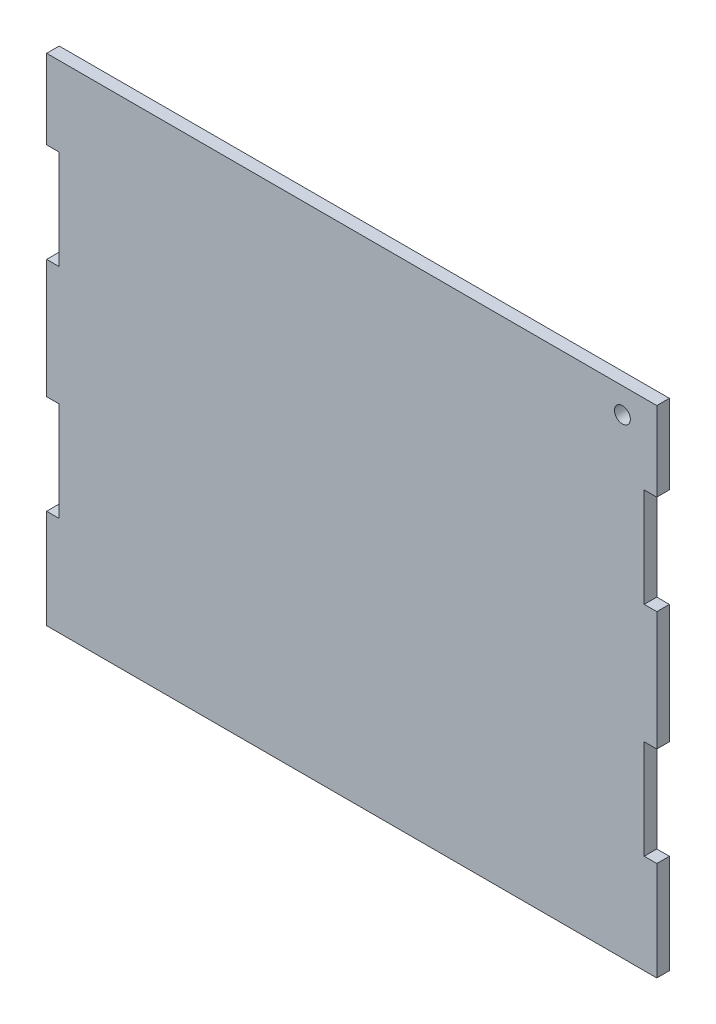
ISO-10303-21;
HEADER;
FILE_DESCRIPTION(('STEP AP214'),'2;1');
FILE_NAME('part.step','',(''),(''),'','','');
FILE_SCHEMA(('AUTOMOTIVE_DESIGN { 1 0 10303 214 1 1 1 1 }'));
ENDSEC;
DATA;
#1=APPLICATION_CONTEXT('core data for automotive mechanical design processes');
#2=APPLICATION_PROTOCOL_DEFINITION('international standard','automotive_design',2000,#1);
#3=PRODUCT_CONTEXT('',#1,'mechanical');
#4=PRODUCT('Part','Part','',(#3));
#5=PRODUCT_RELATED_PRODUCT_CATEGORY('part','',(#4));
#6=PRODUCT_DEFINITION_FORMATION('','',#4);
#7=PRODUCT_DEFINITION_CONTEXT('part definition',#1,'design');
#8=PRODUCT_DEFINITION('design','',#6,#7);
#9=PRODUCT_DEFINITION_SHAPE('','',#8);
#10=(LENGTH_UNIT() NAMED_UNIT(*) SI_UNIT(.MILLI.,.METRE.));
#11=(NAMED_UNIT(*) PLANE_ANGLE_UNIT() SI_UNIT($,.RADIAN.));
#12=(NAMED_UNIT(*) SI_UNIT($,.STERADIAN.) SOLID_ANGLE_UNIT());
#13=UNCERTAINTY_MEASURE_WITH_UNIT(LENGTH_MEASURE(1.E-05),#10,'distance_accuracy_value','');
#14=(GEOMETRIC_REPRESENTATION_CONTEXT(3) GLOBAL_UNCERTAINTY_ASSIGNED_CONTEXT((#13)) GLOBAL_UNIT_ASSIGNED_CONTEXT((#10,
#11,#12)) REPRESENTATION_CONTEXT('',''));
#15=CARTESIAN_POINT('',(0.,0.,0.));
#16=DIRECTION('',(0.,0.,1.));
#17=DIRECTION('',(1.,0.,0.));
#18=AXIS2_PLACEMENT_3D('',#15,#16,#17);
#19=CARTESIAN_POINT('',(0.,0.,6.35));
#20=DIRECTION('',(1.,0.,0.));
#21=DIRECTION('',(0.,1.,0.));
#22=AXIS2_PLACEMENT_3D('',#19,#20,#21);
#23=PLANE('',#22);
#24=DIRECTION('',(0.,-1.,0.));
#25=VECTOR('',#24,1.);
#26=CARTESIAN_POINT('',(0.,0.,0.));
#27=LINE('',#26,#25);
#28=CARTESIAN_POINT('',(0.,160.,0.));
#29=VERTEX_POINT('',#28);
#30=CARTESIAN_POINT('',(0.,100.,0.));
#31=VERTEX_POINT('',#30);
#32=EDGE_CURVE('E205',#29,#31,#27,.T.);
#33=ORIENTED_EDGE('',*,*,#32,.T.);
#34=DIRECTION('',(0.,0.,1.));
#35=VECTOR('',#34,1.);
#36=CARTESIAN_POINT('',(0.,100.,0.));
#37=LINE('',#36,#35);
#38=CARTESIAN_POINT('',(0.,100.,6.35));
#39=VERTEX_POINT('',#38);
#40=EDGE_CURVE('E252',#31,#39,#37,.T.);
#41=ORIENTED_EDGE('',*,*,#40,.T.);
#42=DIRECTION('',(0.,-1.,0.));
#43=VECTOR('',#42,1.);
#44=CARTESIAN_POINT('',(0.,0.,6.35));
#45=LINE('',#44,#43);
#46=CARTESIAN_POINT('',(0.,160.,6.35));
#47=VERTEX_POINT('',#46);
#48=EDGE_CURVE('E344',#47,#39,#45,.T.);
#49=ORIENTED_EDGE('',*,*,#48,.F.);
#50=DIRECTION('',(0.,0.,1.));
#51=VECTOR('',#50,1.);
#52=CARTESIAN_POINT('',(0.,160.,0.));
#53=LINE('',#52,#51);
#54=EDGE_CURVE('E220',#29,#47,#53,.T.);
#55=ORIENTED_EDGE('',*,*,#54,.F.);
#56=EDGE_LOOP('',(#33,#41,#49,#55));
#57=FACE_BOUND('',#56,.T.);
#58=ADVANCED_FACE('F39',(#57),#23,.F.);
#59=CARTESIAN_POINT('',(0.,50.,6.35));
#60=VERTEX_POINT('',#59);
#61=CARTESIAN_POINT('',(0.,0.,6.35));
#62=VERTEX_POINT('',#61);
#63=EDGE_CURVE('E345',#60,#62,#45,.T.);
#64=ORIENTED_EDGE('',*,*,#63,.F.);
#65=DIRECTION('',(0.,0.,1.));
#66=VECTOR('',#65,1.);
#67=CARTESIAN_POINT('',(0.,50.,0.));
#68=LINE('',#67,#66);
#69=CARTESIAN_POINT('',(0.,50.,0.));
#70=VERTEX_POINT('',#69);
#71=EDGE_CURVE('E282',#70,#60,#68,.T.);
#72=ORIENTED_EDGE('',*,*,#71,.F.);
#73=CARTESIAN_POINT('',(0.,0.,0.));
#74=VERTEX_POINT('',#73);
#75=EDGE_CURVE('E330',#70,#74,#27,.T.);
#76=ORIENTED_EDGE('',*,*,#75,.T.);
#77=DIRECTION('',(0.,0.,-1.));
#78=VECTOR('',#77,1.);
#79=CARTESIAN_POINT('',(0.,0.,6.35));
#80=LINE('',#79,#78);
#81=EDGE_CURVE('E11',#62,#74,#80,.T.);
#82=ORIENTED_EDGE('',*,*,#81,.F.);
#83=EDGE_LOOP('',(#64,#72,#76,#82));
#84=FACE_BOUND('',#83,.T.);
#85=ADVANCED_FACE('F404',(#84),#23,.F.);
#86=CARTESIAN_POINT('',(307.7,0.,6.35));
#87=DIRECTION('',(-1.,0.,0.));
#88=DIRECTION('',(0.,-1.,0.));
#89=AXIS2_PLACEMENT_3D('',#86,#87,#88);
#90=PLANE('',#89);
#91=DIRECTION('',(0.,1.,0.));
#92=VECTOR('',#91,1.);
#93=CARTESIAN_POINT('',(307.7,0.,0.));
#94=LINE('',#93,#92);
#95=CARTESIAN_POINT('',(307.7,100.,0.));
#96=VERTEX_POINT('',#95);
#97=CARTESIAN_POINT('',(307.7,160.,0.));
#98=VERTEX_POINT('',#97);
#99=EDGE_CURVE('E371',#96,#98,#94,.T.);
#100=ORIENTED_EDGE('',*,*,#99,.T.);
#101=DIRECTION('',(0.,0.,1.));
#102=VECTOR('',#101,1.);
#103=CARTESIAN_POINT('',(307.7,160.,0.));
#104=LINE('',#103,#102);
#105=CARTESIAN_POINT('',(307.7,160.,6.35));
#106=VERTEX_POINT('',#105);
#107=EDGE_CURVE('E247',#98,#106,#104,.T.);
#108=ORIENTED_EDGE('',*,*,#107,.T.);
#109=DIRECTION('',(0.,1.,0.));
#110=VECTOR('',#109,1.);
#111=CARTESIAN_POINT('',(307.7,0.,6.35));
#112=LINE('',#111,#110);
#113=CARTESIAN_POINT('',(307.7,100.,6.35));
#114=VERTEX_POINT('',#113);
#115=EDGE_CURVE('E354',#114,#106,#112,.T.);
#116=ORIENTED_EDGE('',*,*,#115,.F.);
#117=DIRECTION('',(0.,0.,1.));
#118=VECTOR('',#117,1.);
#119=CARTESIAN_POINT('',(307.7,100.,0.));
#120=LINE('',#119,#118);
#121=EDGE_CURVE('E316',#96,#114,#120,.T.);
#122=ORIENTED_EDGE('',*,*,#121,.F.);
#123=EDGE_LOOP('',(#100,#108,#116,#122));
#124=FACE_BOUND('',#123,.T.);
#125=ADVANCED_FACE('F435',(#124),#90,.F.);
#126=CARTESIAN_POINT('',(307.7,0.,0.));
#127=VERTEX_POINT('',#126);
#128=CARTESIAN_POINT('',(307.7,50.,0.));
#129=VERTEX_POINT('',#128);
#130=EDGE_CURVE('E366',#127,#129,#94,.T.);
#131=ORIENTED_EDGE('',*,*,#130,.T.);
#132=DIRECTION('',(0.,0.,1.));
#133=VECTOR('',#132,1.);
#134=CARTESIAN_POINT('',(307.7,50.,0.));
#135=LINE('',#134,#133);
#136=CARTESIAN_POINT('',(307.7,50.,6.35));
#137=VERTEX_POINT('',#136);
#138=EDGE_CURVE('E326',#129,#137,#135,.T.);
#139=ORIENTED_EDGE('',*,*,#138,.T.);
#140=CARTESIAN_POINT('',(307.7,0.,6.35));
#141=VERTEX_POINT('',#140);
#142=EDGE_CURVE('E349',#141,#137,#112,.T.);
#143=ORIENTED_EDGE('',*,*,#142,.F.);
#144=DIRECTION('',(0.,0.,-1.));
#145=VECTOR('',#144,1.);
#146=CARTESIAN_POINT('',(307.7,0.,6.35));
#147=LINE('',#146,#145);
#148=EDGE_CURVE('E48',#141,#127,#147,.T.);
#149=ORIENTED_EDGE('',*,*,#148,.T.);
#150=EDGE_LOOP('',(#131,#139,#143,#149));
#151=FACE_BOUND('',#150,.T.);
#152=ADVANCED_FACE('F386',(#151),#90,.F.);
#153=CARTESIAN_POINT('',(0.,250.,0.));
#154=VERTEX_POINT('',#153);
#155=CARTESIAN_POINT('',(0.,210.,0.));
#156=VERTEX_POINT('',#155);
#157=EDGE_CURVE('E358',#154,#156,#27,.T.);
#158=ORIENTED_EDGE('',*,*,#157,.T.);
#159=DIRECTION('',(0.,0.,1.));
#160=VECTOR('',#159,1.);
#161=CARTESIAN_POINT('',(0.,210.,0.));
#162=LINE('',#161,#160);
#163=CARTESIAN_POINT('',(0.,210.,6.35));
#164=VERTEX_POINT('',#163);
#165=EDGE_CURVE('E224',#156,#164,#162,.T.);
#166=ORIENTED_EDGE('',*,*,#165,.T.);
#167=CARTESIAN_POINT('',(0.,250.,6.35));
#168=VERTEX_POINT('',#167);
#169=EDGE_CURVE('E339',#168,#164,#45,.T.);
#170=ORIENTED_EDGE('',*,*,#169,.F.);
#171=DIRECTION('',(0.,0.,-1.));
#172=VECTOR('',#171,1.);
#173=CARTESIAN_POINT('',(0.,250.,6.35));
#174=LINE('',#173,#172);
#175=EDGE_CURVE('E357',#168,#154,#174,.T.);
#176=ORIENTED_EDGE('',*,*,#175,.T.);
#177=EDGE_LOOP('',(#158,#166,#170,#176));
#178=FACE_BOUND('',#177,.T.);
#179=ADVANCED_FACE('F41',(#178),#23,.F.);
#180=CARTESIAN_POINT('',(0.,0.,6.35));
#181=DIRECTION('',(0.,1.,0.));
#182=DIRECTION('',(0.,0.,1.));
#183=AXIS2_PLACEMENT_3D('',#180,#181,#182);
#184=PLANE('',#183);
#185=DIRECTION('',(1.,0.,0.));
#186=VECTOR('',#185,1.);
#187=CARTESIAN_POINT('',(0.,0.,0.));
#188=LINE('',#187,#186);
#189=EDGE_CURVE('E362',#74,#127,#188,.T.);
#190=ORIENTED_EDGE('',*,*,#189,.T.);
#191=ORIENTED_EDGE('',*,*,#148,.F.);
#192=DIRECTION('',(1.,0.,0.));
#193=VECTOR('',#192,1.);
#194=CARTESIAN_POINT('',(0.,0.,6.35));
#195=LINE('',#194,#193);
#196=EDGE_CURVE('E343',#62,#141,#195,.T.);
#197=ORIENTED_EDGE('',*,*,#196,.F.);
#198=ORIENTED_EDGE('',*,*,#81,.T.);
#199=EDGE_LOOP('',(#190,#191,#197,#198));
#200=FACE_BOUND('',#199,.T.);
#201=ADVANCED_FACE('F402',(#200),#184,.F.);
#202=CARTESIAN_POINT('',(307.7,210.,6.35));
#203=VERTEX_POINT('',#202);
#204=CARTESIAN_POINT('',(307.7,250.,6.35));
#205=VERTEX_POINT('',#204);
#206=EDGE_CURVE('E348',#203,#205,#112,.T.);
#207=ORIENTED_EDGE('',*,*,#206,.F.);
#208=DIRECTION('',(0.,0.,1.));
#209=VECTOR('',#208,1.);
#210=CARTESIAN_POINT('',(307.7,210.,0.));
#211=LINE('',#210,#209);
#212=CARTESIAN_POINT('',(307.7,210.,0.));
#213=VERTEX_POINT('',#212);
#214=EDGE_CURVE('E266',#213,#203,#211,.T.);
#215=ORIENTED_EDGE('',*,*,#214,.F.);
#216=CARTESIAN_POINT('',(307.7,250.,0.));
#217=VERTEX_POINT('',#216);
#218=EDGE_CURVE('E365',#213,#217,#94,.T.);
#219=ORIENTED_EDGE('',*,*,#218,.T.);
#220=DIRECTION('',(0.,0.,-1.));
#221=VECTOR('',#220,1.);
#222=CARTESIAN_POINT('',(307.7,250.,6.35));
#223=LINE('',#222,#221);
#224=EDGE_CURVE('E377',#205,#217,#223,.T.);
#225=ORIENTED_EDGE('',*,*,#224,.F.);
#226=EDGE_LOOP('',(#207,#215,#219,#225));
#227=FACE_BOUND('',#226,.T.);
#228=ADVANCED_FACE('F427',(#227),#90,.F.);
#229=CARTESIAN_POINT('',(0.,250.,6.35));
#230=DIRECTION('',(0.,-1.,0.));
#231=DIRECTION('',(0.,0.,-1.));
#232=AXIS2_PLACEMENT_3D('',#229,#230,#231);
#233=PLANE('',#232);
#234=DIRECTION('',(-1.,0.,0.));
#235=VECTOR('',#234,1.);
#236=CARTESIAN_POINT('',(0.,250.,0.));
#237=LINE('',#236,#235);
#238=EDGE_CURVE('E370',#217,#154,#237,.T.);
#239=ORIENTED_EDGE('',*,*,#238,.T.);
#240=ORIENTED_EDGE('',*,*,#175,.F.);
#241=DIRECTION('',(-1.,0.,0.));
#242=VECTOR('',#241,1.);
#243=CARTESIAN_POINT('',(0.,250.,6.35));
#244=LINE('',#243,#242);
#245=EDGE_CURVE('E353',#205,#168,#244,.T.);
#246=ORIENTED_EDGE('',*,*,#245,.F.);
#247=ORIENTED_EDGE('',*,*,#224,.T.);
#248=EDGE_LOOP('',(#239,#240,#246,#247));
#249=FACE_BOUND('',#248,.T.);
#250=ADVANCED_FACE('F422',(#249),#233,.F.);
#251=CARTESIAN_POINT('',(0.,0.,6.35));
#252=DIRECTION('',(0.,0.,-1.));
#253=DIRECTION('',(-1.,0.,0.));
#254=AXIS2_PLACEMENT_3D('',#251,#252,#253);
#255=PLANE('',#254);
#256=CARTESIAN_POINT('',(290.35,237.3,6.35));
#257=DIRECTION('',(0.,0.,1.));
#258=DIRECTION('',(1.,0.,0.));
#259=AXIS2_PLACEMENT_3D('',#256,#257,#258);
#260=CIRCLE('',#259,3.99999999999999);
#261=CARTESIAN_POINT('',(294.35,237.3,6.35));
#262=VERTEX_POINT('',#261);
#263=EDGE_CURVE('E233',#262,#262,#260,.T.);
#264=ORIENTED_EDGE('',*,*,#263,.F.);
#265=EDGE_LOOP('',(#264));
#266=FACE_BOUND('',#265,.T.);
#267=ORIENTED_EDGE('',*,*,#115,.T.);
#268=DIRECTION('',(1.,0.,0.));
#269=VECTOR('',#268,1.);
#270=CARTESIAN_POINT('',(307.7,160.,6.35));
#271=LINE('',#270,#269);
#272=CARTESIAN_POINT('',(301.35,160.,6.35));
#273=VERTEX_POINT('',#272);
#274=EDGE_CURVE('E248',#273,#106,#271,.T.);
#275=ORIENTED_EDGE('',*,*,#274,.F.);
#276=DIRECTION('',(0.,-1.,0.));
#277=VECTOR('',#276,1.);
#278=CARTESIAN_POINT('',(301.35,160.,6.35));
#279=LINE('',#278,#277);
#280=CARTESIAN_POINT('',(301.35,210.,6.35));
#281=VERTEX_POINT('',#280);
#282=EDGE_CURVE('E241',#281,#273,#279,.T.);
#283=ORIENTED_EDGE('',*,*,#282,.F.);
#284=DIRECTION('',(-1.,0.,0.));
#285=VECTOR('',#284,1.);
#286=CARTESIAN_POINT('',(307.7,210.,6.35));
#287=LINE('',#286,#285);
#288=EDGE_CURVE('E251',#203,#281,#287,.T.);
#289=ORIENTED_EDGE('',*,*,#288,.F.);
#290=ORIENTED_EDGE('',*,*,#206,.T.);
#291=ORIENTED_EDGE('',*,*,#245,.T.);
#292=ORIENTED_EDGE('',*,*,#169,.T.);
#293=DIRECTION('',(-1.,0.,0.));
#294=VECTOR('',#293,1.);
#295=CARTESIAN_POINT('',(0.,210.,6.35));
#296=LINE('',#295,#294);
#297=CARTESIAN_POINT('',(6.34999999999991,210.,6.35));
#298=VERTEX_POINT('',#297);
#299=EDGE_CURVE('E207',#298,#164,#296,.T.);
#300=ORIENTED_EDGE('',*,*,#299,.F.);
#301=DIRECTION('',(0.,1.,0.));
#302=VECTOR('',#301,1.);
#303=CARTESIAN_POINT('',(6.34999999999992,160.,6.35));
#304=LINE('',#303,#302);
#305=CARTESIAN_POINT('',(6.34999999999992,160.,6.35));
#306=VERTEX_POINT('',#305);
#307=EDGE_CURVE('E210',#306,#298,#304,.T.);
#308=ORIENTED_EDGE('',*,*,#307,.F.);
#309=DIRECTION('',(1.,0.,0.));
#310=VECTOR('',#309,1.);
#311=CARTESIAN_POINT('',(0.,160.,6.35));
#312=LINE('',#311,#310);
#313=EDGE_CURVE('E183',#47,#306,#312,.T.);
#314=ORIENTED_EDGE('',*,*,#313,.F.);
#315=ORIENTED_EDGE('',*,*,#48,.T.);
#316=DIRECTION('',(-1.,0.,0.));
#317=VECTOR('',#316,1.);
#318=CARTESIAN_POINT('',(0.,100.,6.35));
#319=LINE('',#318,#317);
#320=CARTESIAN_POINT('',(6.34999999999993,100.,6.35));
#321=VERTEX_POINT('',#320);
#322=EDGE_CURVE('E276',#321,#39,#319,.T.);
#323=ORIENTED_EDGE('',*,*,#322,.F.);
#324=DIRECTION('',(0.,1.,0.));
#325=VECTOR('',#324,1.);
#326=CARTESIAN_POINT('',(6.34999999999994,50.,6.35));
#327=LINE('',#326,#325);
#328=CARTESIAN_POINT('',(6.34999999999994,50.,6.35));
#329=VERTEX_POINT('',#328);
#330=EDGE_CURVE('E286',#329,#321,#327,.T.);
#331=ORIENTED_EDGE('',*,*,#330,.F.);
#332=DIRECTION('',(1.,0.,0.));
#333=VECTOR('',#332,1.);
#334=CARTESIAN_POINT('',(0.,50.,6.35));
#335=LINE('',#334,#333);
#336=EDGE_CURVE('E223',#60,#329,#335,.T.);
#337=ORIENTED_EDGE('',*,*,#336,.F.);
#338=ORIENTED_EDGE('',*,*,#63,.T.);
#339=ORIENTED_EDGE('',*,*,#196,.T.);
#340=ORIENTED_EDGE('',*,*,#142,.T.);
#341=DIRECTION('',(1.,0.,0.));
#342=VECTOR('',#341,1.);
#343=CARTESIAN_POINT('',(307.7,50.,6.35));
#344=LINE('',#343,#342);
#345=CARTESIAN_POINT('',(301.35,50.,6.35));
#346=VERTEX_POINT('',#345);
#347=EDGE_CURVE('E308',#346,#137,#344,.T.);
#348=ORIENTED_EDGE('',*,*,#347,.F.);
#349=DIRECTION('',(0.,-1.,0.));
#350=VECTOR('',#349,1.);
#351=CARTESIAN_POINT('',(301.35,50.,6.35));
#352=LINE('',#351,#350);
#353=CARTESIAN_POINT('',(301.35,100.,6.35));
#354=VERTEX_POINT('',#353);
#355=EDGE_CURVE('E320',#354,#346,#352,.T.);
#356=ORIENTED_EDGE('',*,*,#355,.F.);
#357=DIRECTION('',(-1.,0.,0.));
#358=VECTOR('',#357,1.);
#359=CARTESIAN_POINT('',(307.7,100.,6.35));
#360=LINE('',#359,#358);
#361=EDGE_CURVE('E262',#114,#354,#360,.T.);
#362=ORIENTED_EDGE('',*,*,#361,.F.);
#363=EDGE_LOOP('',(#267,#275,#283,#289,#290,#291,#292,#300,#308,#314,#315,#323,#331,#337,#338,
#339,#340,#348,#356,#362));
#364=FACE_BOUND('',#363,.T.);
#365=ADVANCED_FACE('F397',(#266,#364),#255,.F.);
#366=CARTESIAN_POINT('',(0.,0.,0.));
#367=DIRECTION('',(0.,0.,-1.));
#368=DIRECTION('',(-1.,0.,0.));
#369=AXIS2_PLACEMENT_3D('',#366,#367,#368);
#370=PLANE('',#369);
#371=DIRECTION('',(1.,0.,0.));
#372=VECTOR('',#371,1.);
#373=CARTESIAN_POINT('',(307.7,160.,0.));
#374=LINE('',#373,#372);
#375=CARTESIAN_POINT('',(301.35,160.,0.));
#376=VERTEX_POINT('',#375);
#377=EDGE_CURVE('E237',#376,#98,#374,.T.);
#378=ORIENTED_EDGE('',*,*,#377,.T.);
#379=ORIENTED_EDGE('',*,*,#99,.F.);
#380=DIRECTION('',(-1.,0.,0.));
#381=VECTOR('',#380,1.);
#382=CARTESIAN_POINT('',(307.7,100.,0.));
#383=LINE('',#382,#381);
#384=CARTESIAN_POINT('',(301.35,100.,0.));
#385=VERTEX_POINT('',#384);
#386=EDGE_CURVE('E303',#96,#385,#383,.T.);
#387=ORIENTED_EDGE('',*,*,#386,.T.);
#388=DIRECTION('',(0.,-1.,0.));
#389=VECTOR('',#388,1.);
#390=CARTESIAN_POINT('',(301.35,50.,0.));
#391=LINE('',#390,#389);
#392=CARTESIAN_POINT('',(301.35,50.,0.));
#393=VERTEX_POINT('',#392);
#394=EDGE_CURVE('E307',#385,#393,#391,.T.);
#395=ORIENTED_EDGE('',*,*,#394,.T.);
#396=DIRECTION('',(1.,0.,0.));
#397=VECTOR('',#396,1.);
#398=CARTESIAN_POINT('',(307.7,50.,0.));
#399=LINE('',#398,#397);
#400=EDGE_CURVE('E312',#393,#129,#399,.T.);
#401=ORIENTED_EDGE('',*,*,#400,.T.);
#402=ORIENTED_EDGE('',*,*,#130,.F.);
#403=ORIENTED_EDGE('',*,*,#189,.F.);
#404=ORIENTED_EDGE('',*,*,#75,.F.);
#405=DIRECTION('',(1.,0.,0.));
#406=VECTOR('',#405,1.);
#407=CARTESIAN_POINT('',(0.,50.,0.));
#408=LINE('',#407,#406);
#409=CARTESIAN_POINT('',(6.34999999999994,50.,0.));
#410=VERTEX_POINT('',#409);
#411=EDGE_CURVE('E272',#70,#410,#408,.T.);
#412=ORIENTED_EDGE('',*,*,#411,.T.);
#413=DIRECTION('',(0.,1.,0.));
#414=VECTOR('',#413,1.);
#415=CARTESIAN_POINT('',(6.34999999999994,50.,0.));
#416=LINE('',#415,#414);
#417=CARTESIAN_POINT('',(6.34999999999993,100.,0.));
#418=VERTEX_POINT('',#417);
#419=EDGE_CURVE('E63',#410,#418,#416,.T.);
#420=ORIENTED_EDGE('',*,*,#419,.T.);
#421=DIRECTION('',(-1.,0.,0.));
#422=VECTOR('',#421,1.);
#423=CARTESIAN_POINT('',(0.,100.,0.));
#424=LINE('',#423,#422);
#425=EDGE_CURVE('E279',#418,#31,#424,.T.);
#426=ORIENTED_EDGE('',*,*,#425,.T.);
#427=ORIENTED_EDGE('',*,*,#32,.F.);
#428=DIRECTION('',(1.,0.,0.));
#429=VECTOR('',#428,1.);
#430=CARTESIAN_POINT('',(0.,160.,0.));
#431=LINE('',#430,#429);
#432=CARTESIAN_POINT('',(6.34999999999992,160.,0.));
#433=VERTEX_POINT('',#432);
#434=EDGE_CURVE('E180',#29,#433,#431,.T.);
#435=ORIENTED_EDGE('',*,*,#434,.T.);
#436=DIRECTION('',(0.,1.,0.));
#437=VECTOR('',#436,1.);
#438=CARTESIAN_POINT('',(6.34999999999992,160.,0.));
#439=LINE('',#438,#437);
#440=CARTESIAN_POINT('',(6.34999999999991,210.,0.));
#441=VERTEX_POINT('',#440);
#442=EDGE_CURVE('E193',#433,#441,#439,.T.);
#443=ORIENTED_EDGE('',*,*,#442,.T.);
#444=DIRECTION('',(-1.,0.,0.));
#445=VECTOR('',#444,1.);
#446=CARTESIAN_POINT('',(0.,210.,0.));
#447=LINE('',#446,#445);
#448=EDGE_CURVE('E189',#441,#156,#447,.T.);
#449=ORIENTED_EDGE('',*,*,#448,.T.);
#450=ORIENTED_EDGE('',*,*,#157,.F.);
#451=ORIENTED_EDGE('',*,*,#238,.F.);
#452=ORIENTED_EDGE('',*,*,#218,.F.);
#453=DIRECTION('',(-1.,0.,0.));
#454=VECTOR('',#453,1.);
#455=CARTESIAN_POINT('',(307.7,210.,0.));
#456=LINE('',#455,#454);
#457=CARTESIAN_POINT('',(301.35,210.,0.));
#458=VERTEX_POINT('',#457);
#459=EDGE_CURVE('E240',#213,#458,#456,.T.);
#460=ORIENTED_EDGE('',*,*,#459,.T.);
#461=DIRECTION('',(0.,-1.,0.));
#462=VECTOR('',#461,1.);
#463=CARTESIAN_POINT('',(301.35,160.,0.));
#464=LINE('',#463,#462);
#465=EDGE_CURVE('E55',#458,#376,#464,.T.);
#466=ORIENTED_EDGE('',*,*,#465,.T.);
#467=EDGE_LOOP('',(#378,#379,#387,#395,#401,#402,#403,#404,#412,#420,#426,#427,#435,#443,#449,
#450,#451,#452,#460,#466));
#468=FACE_BOUND('',#467,.T.);
#469=CARTESIAN_POINT('',(290.35,237.3,0.));
#470=DIRECTION('',(0.,0.,1.));
#471=DIRECTION('',(1.,0.,0.));
#472=AXIS2_PLACEMENT_3D('',#469,#470,#471);
#473=CIRCLE('',#472,3.99999999999999);
#474=CARTESIAN_POINT('',(294.35,237.3,0.));
#475=VERTEX_POINT('',#474);
#476=EDGE_CURVE('E217',#475,#475,#473,.T.);
#477=ORIENTED_EDGE('',*,*,#476,.T.);
#478=EDGE_LOOP('',(#477));
#479=FACE_BOUND('',#478,.T.);
#480=ADVANCED_FACE('F201',(#468,#479),#370,.T.);
#481=CARTESIAN_POINT('',(307.7,50.,0.));
#482=DIRECTION('',(0.,-1.,0.));
#483=DIRECTION('',(0.,0.,-1.));
#484=AXIS2_PLACEMENT_3D('',#481,#482,#483);
#485=PLANE('',#484);
#486=ORIENTED_EDGE('',*,*,#347,.T.);
#487=ORIENTED_EDGE('',*,*,#138,.F.);
#488=ORIENTED_EDGE('',*,*,#400,.F.);
#489=DIRECTION('',(0.,0.,1.));
#490=VECTOR('',#489,1.);
#491=CARTESIAN_POINT('',(301.35,50.,0.));
#492=LINE('',#491,#490);
#493=EDGE_CURVE('E331',#393,#346,#492,.T.);
#494=ORIENTED_EDGE('',*,*,#493,.T.);
#495=EDGE_LOOP('',(#486,#487,#488,#494));
#496=FACE_BOUND('',#495,.T.);
#497=ADVANCED_FACE('F393',(#496),#485,.F.);
#498=CARTESIAN_POINT('',(301.35,50.,0.));
#499=DIRECTION('',(-1.,0.,0.));
#500=DIRECTION('',(0.,0.,1.));
#501=AXIS2_PLACEMENT_3D('',#498,#499,#500);
#502=PLANE('',#501);
#503=ORIENTED_EDGE('',*,*,#355,.T.);
#504=ORIENTED_EDGE('',*,*,#493,.F.);
#505=ORIENTED_EDGE('',*,*,#394,.F.);
#506=DIRECTION('',(0.,0.,1.));
#507=VECTOR('',#506,1.);
#508=CARTESIAN_POINT('',(301.35,100.,0.));
#509=LINE('',#508,#507);
#510=EDGE_CURVE('E334',#385,#354,#509,.T.);
#511=ORIENTED_EDGE('',*,*,#510,.T.);
#512=EDGE_LOOP('',(#503,#504,#505,#511));
#513=FACE_BOUND('',#512,.T.);
#514=ADVANCED_FACE('F489',(#513),#502,.F.);
#515=CARTESIAN_POINT('',(307.7,100.,0.));
#516=DIRECTION('',(0.,1.,0.));
#517=DIRECTION('',(0.,0.,1.));
#518=AXIS2_PLACEMENT_3D('',#515,#516,#517);
#519=PLANE('',#518);
#520=ORIENTED_EDGE('',*,*,#361,.T.);
#521=ORIENTED_EDGE('',*,*,#510,.F.);
#522=ORIENTED_EDGE('',*,*,#386,.F.);
#523=ORIENTED_EDGE('',*,*,#121,.T.);
#524=EDGE_LOOP('',(#520,#521,#522,#523));
#525=FACE_BOUND('',#524,.T.);
#526=ADVANCED_FACE('F485',(#525),#519,.F.);
#527=CARTESIAN_POINT('',(290.35,237.3,0.));
#528=DIRECTION('',(0.,0.,1.));
#529=DIRECTION('',(1.,0.,0.));
#530=AXIS2_PLACEMENT_3D('',#527,#528,#529);
#531=CYLINDRICAL_SURFACE('',#530,3.99999999999999);
#532=ORIENTED_EDGE('',*,*,#476,.F.);
#533=EDGE_LOOP('',(#532));
#534=FACE_BOUND('',#533,.T.);
#535=ORIENTED_EDGE('',*,*,#263,.T.);
#536=EDGE_LOOP('',(#535));
#537=FACE_BOUND('',#536,.T.);
#538=ADVANCED_FACE('F488',(#534,#537),#531,.F.);
#539=CARTESIAN_POINT('',(0.,160.,0.));
#540=DIRECTION('',(0.,-1.,0.));
#541=DIRECTION('',(1.,0.,0.));
#542=AXIS2_PLACEMENT_3D('',#539,#540,#541);
#543=PLANE('',#542);
#544=ORIENTED_EDGE('',*,*,#313,.T.);
#545=DIRECTION('',(0.,0.,1.));
#546=VECTOR('',#545,1.);
#547=CARTESIAN_POINT('',(6.34999999999992,160.,0.));
#548=LINE('',#547,#546);
#549=EDGE_CURVE('E176',#433,#306,#548,.T.);
#550=ORIENTED_EDGE('',*,*,#549,.F.);
#551=ORIENTED_EDGE('',*,*,#434,.F.);
#552=ORIENTED_EDGE('',*,*,#54,.T.);
#553=EDGE_LOOP('',(#544,#550,#551,#552));
#554=FACE_BOUND('',#553,.T.);
#555=ADVANCED_FACE('F178',(#554),#543,.F.);
#556=CARTESIAN_POINT('',(0.,210.,0.));
#557=DIRECTION('',(0.,1.,0.));
#558=DIRECTION('',(0.,0.,1.));
#559=AXIS2_PLACEMENT_3D('',#556,#557,#558);
#560=PLANE('',#559);
#561=ORIENTED_EDGE('',*,*,#299,.T.);
#562=ORIENTED_EDGE('',*,*,#165,.F.);
#563=ORIENTED_EDGE('',*,*,#448,.F.);
#564=DIRECTION('',(0.,0.,1.));
#565=VECTOR('',#564,1.);
#566=CARTESIAN_POINT('',(6.34999999999991,210.,0.));
#567=LINE('',#566,#565);
#568=EDGE_CURVE('E188',#441,#298,#567,.T.);
#569=ORIENTED_EDGE('',*,*,#568,.T.);
#570=EDGE_LOOP('',(#561,#562,#563,#569));
#571=FACE_BOUND('',#570,.T.);
#572=ADVANCED_FACE('F415',(#571),#560,.F.);
#573=CARTESIAN_POINT('',(6.34999999999992,160.,0.));
#574=DIRECTION('',(1.,0.,0.));
#575=DIRECTION('',(0.,1.,0.));
#576=AXIS2_PLACEMENT_3D('',#573,#574,#575);
#577=PLANE('',#576);
#578=ORIENTED_EDGE('',*,*,#307,.T.);
#579=ORIENTED_EDGE('',*,*,#568,.F.);
#580=ORIENTED_EDGE('',*,*,#442,.F.);
#581=ORIENTED_EDGE('',*,*,#549,.T.);
#582=EDGE_LOOP('',(#578,#579,#580,#581));
#583=FACE_BOUND('',#582,.T.);
#584=ADVANCED_FACE('F194',(#583),#577,.F.);
#585=CARTESIAN_POINT('',(0.,100.,0.));
#586=DIRECTION('',(0.,1.,0.));
#587=DIRECTION('',(0.,0.,1.));
#588=AXIS2_PLACEMENT_3D('',#585,#586,#587);
#589=PLANE('',#588);
#590=ORIENTED_EDGE('',*,*,#322,.T.);
#591=ORIENTED_EDGE('',*,*,#40,.F.);
#592=ORIENTED_EDGE('',*,*,#425,.F.);
#593=DIRECTION('',(0.,0.,1.));
#594=VECTOR('',#593,1.);
#595=CARTESIAN_POINT('',(6.34999999999993,100.,0.));
#596=LINE('',#595,#594);
#597=EDGE_CURVE('E295',#418,#321,#596,.T.);
#598=ORIENTED_EDGE('',*,*,#597,.T.);
#599=EDGE_LOOP('',(#590,#591,#592,#598));
#600=FACE_BOUND('',#599,.T.);
#601=ADVANCED_FACE('F502',(#600),#589,.F.);
#602=CARTESIAN_POINT('',(6.34999999999994,50.,0.));
#603=DIRECTION('',(1.,0.,0.));
#604=DIRECTION('',(0.,1.,0.));
#605=AXIS2_PLACEMENT_3D('',#602,#603,#604);
#606=PLANE('',#605);
#607=ORIENTED_EDGE('',*,*,#330,.T.);
#608=ORIENTED_EDGE('',*,*,#597,.F.);
#609=ORIENTED_EDGE('',*,*,#419,.F.);
#610=DIRECTION('',(0.,0.,1.));
#611=VECTOR('',#610,1.);
#612=CARTESIAN_POINT('',(6.34999999999994,50.,0.));
#613=LINE('',#612,#611);
#614=EDGE_CURVE('E298',#410,#329,#613,.T.);
#615=ORIENTED_EDGE('',*,*,#614,.T.);
#616=EDGE_LOOP('',(#607,#608,#609,#615));
#617=FACE_BOUND('',#616,.T.);
#618=ADVANCED_FACE('F498',(#617),#606,.F.);
#619=CARTESIAN_POINT('',(0.,50.,0.));
#620=DIRECTION('',(0.,-1.,0.));
#621=DIRECTION('',(1.,0.,0.));
#622=AXIS2_PLACEMENT_3D('',#619,#620,#621);
#623=PLANE('',#622);
#624=ORIENTED_EDGE('',*,*,#336,.T.);
#625=ORIENTED_EDGE('',*,*,#614,.F.);
#626=ORIENTED_EDGE('',*,*,#411,.F.);
#627=ORIENTED_EDGE('',*,*,#71,.T.);
#628=EDGE_LOOP('',(#624,#625,#626,#627));
#629=FACE_BOUND('',#628,.T.);
#630=ADVANCED_FACE('F456',(#629),#623,.F.);
#631=CARTESIAN_POINT('',(307.7,160.,0.));
#632=DIRECTION('',(0.,-1.,0.));
#633=DIRECTION('',(0.,0.,-1.));
#634=AXIS2_PLACEMENT_3D('',#631,#632,#633);
#635=PLANE('',#634);
#636=ORIENTED_EDGE('',*,*,#274,.T.);
#637=ORIENTED_EDGE('',*,*,#107,.F.);
#638=ORIENTED_EDGE('',*,*,#377,.F.);
#639=DIRECTION('',(0.,0.,1.));
#640=VECTOR('',#639,1.);
#641=CARTESIAN_POINT('',(301.35,160.,0.));
#642=LINE('',#641,#640);
#643=EDGE_CURVE('E259',#376,#273,#642,.T.);
#644=ORIENTED_EDGE('',*,*,#643,.T.);
#645=EDGE_LOOP('',(#636,#637,#638,#644));
#646=FACE_BOUND('',#645,.T.);
#647=ADVANCED_FACE('F439',(#646),#635,.F.);
#648=CARTESIAN_POINT('',(301.35,160.,0.));
#649=DIRECTION('',(-1.,0.,0.));
#650=DIRECTION('',(0.,0.,1.));
#651=AXIS2_PLACEMENT_3D('',#648,#649,#650);
#652=PLANE('',#651);
#653=ORIENTED_EDGE('',*,*,#282,.T.);
#654=ORIENTED_EDGE('',*,*,#643,.F.);
#655=ORIENTED_EDGE('',*,*,#465,.F.);
#656=DIRECTION('',(0.,0.,1.));
#657=VECTOR('',#656,1.);
#658=CARTESIAN_POINT('',(301.35,210.,0.));
#659=LINE('',#658,#657);
#660=EDGE_CURVE('E263',#458,#281,#659,.T.);
#661=ORIENTED_EDGE('',*,*,#660,.T.);
#662=EDGE_LOOP('',(#653,#654,#655,#661));
#663=FACE_BOUND('',#662,.T.);
#664=ADVANCED_FACE('F448',(#663),#652,.F.);
#665=CARTESIAN_POINT('',(307.7,210.,0.));
#666=DIRECTION('',(0.,1.,0.));
#667=DIRECTION('',(0.,0.,1.));
#668=AXIS2_PLACEMENT_3D('',#665,#666,#667);
#669=PLANE('',#668);
#670=ORIENTED_EDGE('',*,*,#288,.T.);
#671=ORIENTED_EDGE('',*,*,#660,.F.);
#672=ORIENTED_EDGE('',*,*,#459,.F.);
#673=ORIENTED_EDGE('',*,*,#214,.T.);
#674=EDGE_LOOP('',(#670,#671,#672,#673));
#675=FACE_BOUND('',#674,.T.);
#676=ADVANCED_FACE('F447',(#675),#669,.F.);
#677=CLOSED_SHELL('',(#58,#85,#125,#152,#179,#201,#228,#250,#365,#480,#497,#514,#526,#538,#555,
#572,#584,#601,#618,#630,#647,#664,#676));
#678=MANIFOLD_SOLID_BREP('B2',#677);
#679=ADVANCED_BREP_SHAPE_REPRESENTATION('',(#18,#678),#14);
#680=SHAPE_DEFINITION_REPRESENTATION(#9,#679);
ENDSEC;
END-ISO-10303-21;
